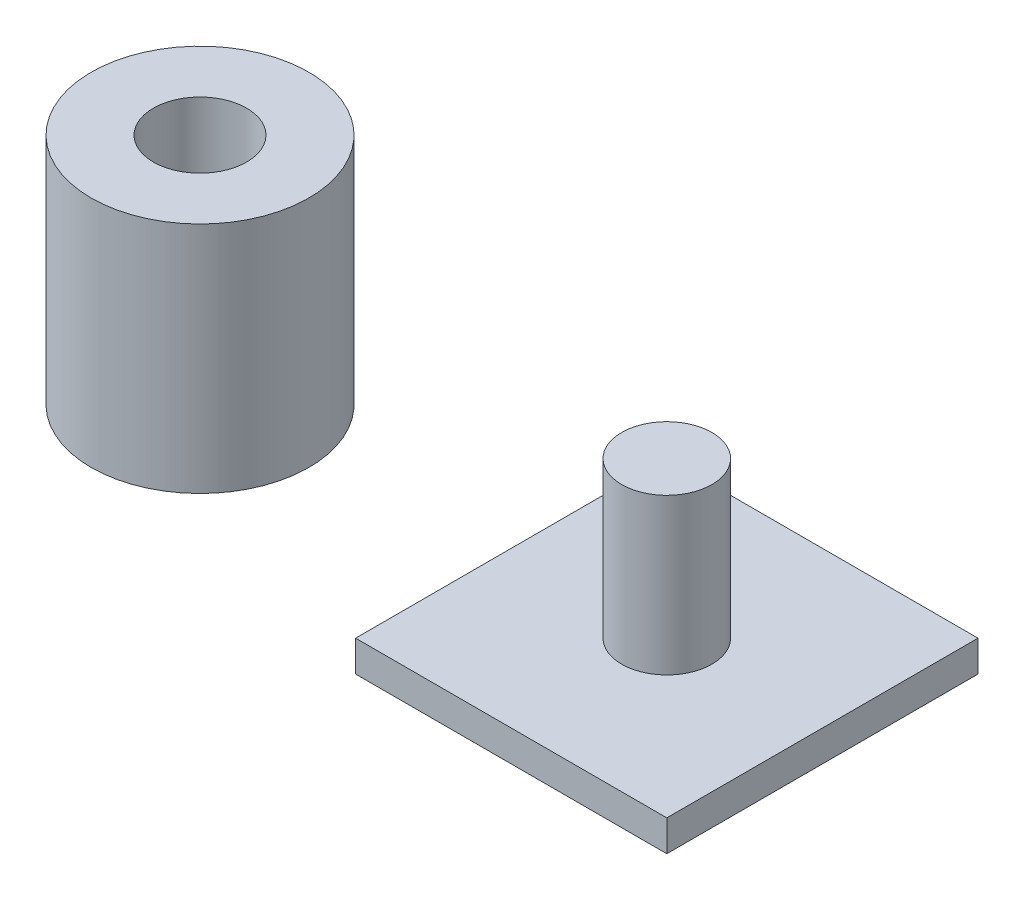
ISO-10303-21;
HEADER;
FILE_DESCRIPTION(('STEP AP214'),'2;1');
FILE_NAME('part.step','',(''),(''),'','','');
FILE_SCHEMA(('AUTOMOTIVE_DESIGN { 1 0 10303 214 1 1 1 1 }'));
ENDSEC;
DATA;
#1=APPLICATION_CONTEXT('core data for automotive mechanical design processes');
#2=APPLICATION_PROTOCOL_DEFINITION('international standard','automotive_design',2000,#1);
#3=PRODUCT_CONTEXT('',#1,'mechanical');
#4=PRODUCT('Part','Part','',(#3));
#5=PRODUCT_RELATED_PRODUCT_CATEGORY('part','',(#4));
#6=PRODUCT_DEFINITION_FORMATION('','',#4);
#7=PRODUCT_DEFINITION_CONTEXT('part definition',#1,'design');
#8=PRODUCT_DEFINITION('design','',#6,#7);
#9=PRODUCT_DEFINITION_SHAPE('','',#8);
#10=(LENGTH_UNIT() NAMED_UNIT(*) SI_UNIT(.MILLI.,.METRE.));
#11=(NAMED_UNIT(*) PLANE_ANGLE_UNIT() SI_UNIT($,.RADIAN.));
#12=(NAMED_UNIT(*) SI_UNIT($,.STERADIAN.) SOLID_ANGLE_UNIT());
#13=UNCERTAINTY_MEASURE_WITH_UNIT(LENGTH_MEASURE(1.E-05),#10,'distance_accuracy_value','');
#14=(GEOMETRIC_REPRESENTATION_CONTEXT(3) GLOBAL_UNCERTAINTY_ASSIGNED_CONTEXT((#13)) GLOBAL_UNIT_ASSIGNED_CONTEXT((#10,
#11,#12)) REPRESENTATION_CONTEXT('',''));
#15=CARTESIAN_POINT('',(0.,0.,0.));
#16=DIRECTION('',(0.,0.,1.));
#17=DIRECTION('',(1.,0.,0.));
#18=AXIS2_PLACEMENT_3D('',#15,#16,#17);
#19=CARTESIAN_POINT('',(-30.,15.,0.));
#20=DIRECTION('',(0.,1.,0.));
#21=DIRECTION('',(0.,0.,1.));
#22=AXIS2_PLACEMENT_3D('',#19,#20,#21);
#23=PLANE('',#22);
#24=CARTESIAN_POINT('',(-30.,15.,0.));
#25=DIRECTION('',(0.,1.,0.));
#26=DIRECTION('',(0.,0.,1.));
#27=AXIS2_PLACEMENT_3D('',#24,#25,#26);
#28=CIRCLE('',#27,7.);
#29=CARTESIAN_POINT('',(-30.,15.,7.));
#30=VERTEX_POINT('',#29);
#31=EDGE_CURVE('E11',#30,#30,#28,.T.);
#32=ORIENTED_EDGE('',*,*,#31,.T.);
#33=EDGE_LOOP('',(#32));
#34=FACE_BOUND('',#33,.T.);
#35=CARTESIAN_POINT('',(-30.,15.,0.));
#36=DIRECTION('',(0.,1.,0.));
#37=DIRECTION('',(0.,0.,1.));
#38=AXIS2_PLACEMENT_3D('',#35,#36,#37);
#39=CIRCLE('',#38,3.);
#40=CARTESIAN_POINT('',(-30.,15.,3.));
#41=VERTEX_POINT('',#40);
#42=EDGE_CURVE('E66',#41,#41,#39,.T.);
#43=ORIENTED_EDGE('',*,*,#42,.F.);
#44=EDGE_LOOP('',(#43));
#45=FACE_BOUND('',#44,.T.);
#46=ADVANCED_FACE('F53',(#34,#45),#23,.T.);
#47=CARTESIAN_POINT('',(-30.,0.,0.));
#48=DIRECTION('',(0.,1.,0.));
#49=DIRECTION('',(0.,0.,1.));
#50=AXIS2_PLACEMENT_3D('',#47,#48,#49);
#51=PLANE('',#50);
#52=CARTESIAN_POINT('',(-30.,0.,0.));
#53=DIRECTION('',(0.,1.,0.));
#54=DIRECTION('',(0.,0.,1.));
#55=AXIS2_PLACEMENT_3D('',#52,#53,#54);
#56=CIRCLE('',#55,7.);
#57=CARTESIAN_POINT('',(-30.,0.,7.));
#58=VERTEX_POINT('',#57);
#59=EDGE_CURVE('E57',#58,#58,#56,.T.);
#60=ORIENTED_EDGE('',*,*,#59,.F.);
#61=EDGE_LOOP('',(#60));
#62=FACE_BOUND('',#61,.T.);
#63=CARTESIAN_POINT('',(-30.,0.,0.));
#64=DIRECTION('',(0.,1.,0.));
#65=DIRECTION('',(0.,0.,1.));
#66=AXIS2_PLACEMENT_3D('',#63,#64,#65);
#67=CIRCLE('',#66,3.);
#68=CARTESIAN_POINT('',(-30.,0.,3.));
#69=VERTEX_POINT('',#68);
#70=EDGE_CURVE('E68',#69,#69,#67,.T.);
#71=ORIENTED_EDGE('',*,*,#70,.T.);
#72=EDGE_LOOP('',(#71));
#73=FACE_BOUND('',#72,.T.);
#74=ADVANCED_FACE('F80',(#62,#73),#51,.F.);
#75=CARTESIAN_POINT('',(-30.,15.,0.));
#76=DIRECTION('',(0.,-1.,0.));
#77=DIRECTION('',(0.,0.,-1.));
#78=AXIS2_PLACEMENT_3D('',#75,#76,#77);
#79=CYLINDRICAL_SURFACE('',#78,7.);
#80=ORIENTED_EDGE('',*,*,#31,.F.);
#81=EDGE_LOOP('',(#80));
#82=FACE_BOUND('',#81,.T.);
#83=ORIENTED_EDGE('',*,*,#59,.T.);
#84=EDGE_LOOP('',(#83));
#85=FACE_BOUND('',#84,.T.);
#86=ADVANCED_FACE('F55',(#82,#85),#79,.T.);
#87=CARTESIAN_POINT('',(-30.,15.,0.));
#88=DIRECTION('',(0.,-1.,0.));
#89=DIRECTION('',(0.,0.,-1.));
#90=AXIS2_PLACEMENT_3D('',#87,#88,#89);
#91=CYLINDRICAL_SURFACE('',#90,3.);
#92=ORIENTED_EDGE('',*,*,#42,.T.);
#93=EDGE_LOOP('',(#92));
#94=FACE_BOUND('',#93,.T.);
#95=ORIENTED_EDGE('',*,*,#70,.F.);
#96=EDGE_LOOP('',(#95));
#97=FACE_BOUND('',#96,.T.);
#98=ADVANCED_FACE('F76',(#94,#97),#91,.F.);
#99=CLOSED_SHELL('',(#46,#74,#86,#98));
#100=MANIFOLD_SOLID_BREP('B2',#99);
#101=CARTESIAN_POINT('',(0.,12.,0.));
#102=DIRECTION('',(0.,-1.,0.));
#103=DIRECTION('',(0.,0.,-1.));
#104=AXIS2_PLACEMENT_3D('',#101,#102,#103);
#105=CYLINDRICAL_SURFACE('',#104,2.9);
#106=CARTESIAN_POINT('',(0.,2.,0.));
#107=DIRECTION('',(0.,1.,0.));
#108=DIRECTION('',(0.,0.,1.));
#109=AXIS2_PLACEMENT_3D('',#106,#107,#108);
#110=CIRCLE('',#109,2.9);
#111=CARTESIAN_POINT('',(0.,2.,2.9));
#112=VERTEX_POINT('',#111);
#113=EDGE_CURVE('E197',#112,#112,#110,.T.);
#114=ORIENTED_EDGE('',*,*,#113,.T.);
#115=EDGE_LOOP('',(#114));
#116=FACE_BOUND('',#115,.T.);
#117=CARTESIAN_POINT('',(0.,12.,0.));
#118=DIRECTION('',(0.,1.,0.));
#119=DIRECTION('',(0.,0.,1.));
#120=AXIS2_PLACEMENT_3D('',#117,#118,#119);
#121=CIRCLE('',#120,2.9);
#122=CARTESIAN_POINT('',(0.,12.,2.9));
#123=VERTEX_POINT('',#122);
#124=EDGE_CURVE('E51',#123,#123,#121,.T.);
#125=ORIENTED_EDGE('',*,*,#124,.F.);
#126=EDGE_LOOP('',(#125));
#127=FACE_BOUND('',#126,.T.);
#128=ADVANCED_FACE('F127',(#116,#127),#105,.T.);
#129=CARTESIAN_POINT('',(0.,12.,0.));
#130=DIRECTION('',(0.,1.,0.));
#131=DIRECTION('',(0.,0.,1.));
#132=AXIS2_PLACEMENT_3D('',#129,#130,#131);
#133=PLANE('',#132);
#134=ORIENTED_EDGE('',*,*,#124,.T.);
#135=EDGE_LOOP('',(#134));
#136=FACE_BOUND('',#135,.T.);
#137=ADVANCED_FACE('F215',(#136),#133,.T.);
#138=CARTESIAN_POINT('',(0.,2.,0.));
#139=DIRECTION('',(0.,1.,0.));
#140=DIRECTION('',(0.,0.,1.));
#141=AXIS2_PLACEMENT_3D('',#138,#139,#140);
#142=PLANE('',#141);
#143=DIRECTION('',(0.,0.,-1.));
#144=VECTOR('',#143,1.);
#145=CARTESIAN_POINT('',(10.,2.,-10.));
#146=LINE('',#145,#144);
#147=CARTESIAN_POINT('',(10.,2.,10.));
#148=VERTEX_POINT('',#147);
#149=CARTESIAN_POINT('',(10.,2.,-10.));
#150=VERTEX_POINT('',#149);
#151=EDGE_CURVE('E180',#148,#150,#146,.T.);
#152=ORIENTED_EDGE('',*,*,#151,.T.);
#153=DIRECTION('',(-1.,0.,0.));
#154=VECTOR('',#153,1.);
#155=CARTESIAN_POINT('',(-10.,2.,-10.));
#156=LINE('',#155,#154);
#157=CARTESIAN_POINT('',(-10.,2.,-10.));
#158=VERTEX_POINT('',#157);
#159=EDGE_CURVE('E174',#150,#158,#156,.T.);
#160=ORIENTED_EDGE('',*,*,#159,.T.);
#161=DIRECTION('',(0.,0.,1.));
#162=VECTOR('',#161,1.);
#163=CARTESIAN_POINT('',(-10.,2.,-10.));
#164=LINE('',#163,#162);
#165=CARTESIAN_POINT('',(-10.,2.,10.));
#166=VERTEX_POINT('',#165);
#167=EDGE_CURVE('E178',#158,#166,#164,.T.);
#168=ORIENTED_EDGE('',*,*,#167,.T.);
#169=DIRECTION('',(1.,0.,0.));
#170=VECTOR('',#169,1.);
#171=CARTESIAN_POINT('',(-10.,2.,10.));
#172=LINE('',#171,#170);
#173=EDGE_CURVE('E143',#166,#148,#172,.T.);
#174=ORIENTED_EDGE('',*,*,#173,.T.);
#175=EDGE_LOOP('',(#152,#160,#168,#174));
#176=FACE_BOUND('',#175,.T.);
#177=ORIENTED_EDGE('',*,*,#113,.F.);
#178=EDGE_LOOP('',(#177));
#179=FACE_BOUND('',#178,.T.);
#180=ADVANCED_FACE('F175',(#176,#179),#142,.T.);
#181=CARTESIAN_POINT('',(10.,2.,-10.));
#182=DIRECTION('',(-1.,0.,0.));
#183=DIRECTION('',(0.,0.,1.));
#184=AXIS2_PLACEMENT_3D('',#181,#182,#183);
#185=PLANE('',#184);
#186=DIRECTION('',(0.,0.,-1.));
#187=VECTOR('',#186,1.);
#188=CARTESIAN_POINT('',(10.,0.,-10.));
#189=LINE('',#188,#187);
#190=CARTESIAN_POINT('',(10.,0.,10.));
#191=VERTEX_POINT('',#190);
#192=CARTESIAN_POINT('',(10.,0.,-10.));
#193=VERTEX_POINT('',#192);
#194=EDGE_CURVE('E194',#191,#193,#189,.T.);
#195=ORIENTED_EDGE('',*,*,#194,.T.);
#196=DIRECTION('',(0.,-1.,0.));
#197=VECTOR('',#196,1.);
#198=CARTESIAN_POINT('',(10.,2.,-10.));
#199=LINE('',#198,#197);
#200=EDGE_CURVE('E135',#150,#193,#199,.T.);
#201=ORIENTED_EDGE('',*,*,#200,.F.);
#202=ORIENTED_EDGE('',*,*,#151,.F.);
#203=DIRECTION('',(0.,-1.,0.));
#204=VECTOR('',#203,1.);
#205=CARTESIAN_POINT('',(10.,2.,10.));
#206=LINE('',#205,#204);
#207=EDGE_CURVE('E190',#148,#191,#206,.T.);
#208=ORIENTED_EDGE('',*,*,#207,.T.);
#209=EDGE_LOOP('',(#195,#201,#202,#208));
#210=FACE_BOUND('',#209,.T.);
#211=ADVANCED_FACE('F204',(#210),#185,.F.);
#212=CARTESIAN_POINT('',(-10.,2.,-10.));
#213=DIRECTION('',(0.,0.,1.));
#214=DIRECTION('',(1.,0.,0.));
#215=AXIS2_PLACEMENT_3D('',#212,#213,#214);
#216=PLANE('',#215);
#217=DIRECTION('',(-1.,0.,0.));
#218=VECTOR('',#217,1.);
#219=CARTESIAN_POINT('',(-10.,0.,-10.));
#220=LINE('',#219,#218);
#221=CARTESIAN_POINT('',(-10.,0.,-10.));
#222=VERTEX_POINT('',#221);
#223=EDGE_CURVE('E185',#193,#222,#220,.T.);
#224=ORIENTED_EDGE('',*,*,#223,.T.);
#225=DIRECTION('',(0.,-1.,0.));
#226=VECTOR('',#225,1.);
#227=CARTESIAN_POINT('',(-10.,2.,-10.));
#228=LINE('',#227,#226);
#229=EDGE_CURVE('E183',#158,#222,#228,.T.);
#230=ORIENTED_EDGE('',*,*,#229,.F.);
#231=ORIENTED_EDGE('',*,*,#159,.F.);
#232=ORIENTED_EDGE('',*,*,#200,.T.);
#233=EDGE_LOOP('',(#224,#230,#231,#232));
#234=FACE_BOUND('',#233,.T.);
#235=ADVANCED_FACE('F184',(#234),#216,.F.);
#236=CARTESIAN_POINT('',(-10.,2.,-10.));
#237=DIRECTION('',(1.,0.,0.));
#238=DIRECTION('',(0.,0.,-1.));
#239=AXIS2_PLACEMENT_3D('',#236,#237,#238);
#240=PLANE('',#239);
#241=DIRECTION('',(0.,0.,1.));
#242=VECTOR('',#241,1.);
#243=CARTESIAN_POINT('',(-10.,0.,-10.));
#244=LINE('',#243,#242);
#245=CARTESIAN_POINT('',(-10.,0.,10.));
#246=VERTEX_POINT('',#245);
#247=EDGE_CURVE('E160',#222,#246,#244,.T.);
#248=ORIENTED_EDGE('',*,*,#247,.T.);
#249=DIRECTION('',(0.,-1.,0.));
#250=VECTOR('',#249,1.);
#251=CARTESIAN_POINT('',(-10.,2.,10.));
#252=LINE('',#251,#250);
#253=EDGE_CURVE('E186',#166,#246,#252,.T.);
#254=ORIENTED_EDGE('',*,*,#253,.F.);
#255=ORIENTED_EDGE('',*,*,#167,.F.);
#256=ORIENTED_EDGE('',*,*,#229,.T.);
#257=EDGE_LOOP('',(#248,#254,#255,#256));
#258=FACE_BOUND('',#257,.T.);
#259=ADVANCED_FACE('F188',(#258),#240,.F.);
#260=CARTESIAN_POINT('',(-10.,2.,10.));
#261=DIRECTION('',(0.,0.,-1.));
#262=DIRECTION('',(-1.,0.,0.));
#263=AXIS2_PLACEMENT_3D('',#260,#261,#262);
#264=PLANE('',#263);
#265=DIRECTION('',(1.,0.,0.));
#266=VECTOR('',#265,1.);
#267=CARTESIAN_POINT('',(-10.,0.,10.));
#268=LINE('',#267,#266);
#269=EDGE_CURVE('E166',#246,#191,#268,.T.);
#270=ORIENTED_EDGE('',*,*,#269,.T.);
#271=ORIENTED_EDGE('',*,*,#207,.F.);
#272=ORIENTED_EDGE('',*,*,#173,.F.);
#273=ORIENTED_EDGE('',*,*,#253,.T.);
#274=EDGE_LOOP('',(#270,#271,#272,#273));
#275=FACE_BOUND('',#274,.T.);
#276=ADVANCED_FACE('F208',(#275),#264,.F.);
#277=CARTESIAN_POINT('',(0.,0.,0.));
#278=DIRECTION('',(0.,1.,0.));
#279=DIRECTION('',(0.,0.,1.));
#280=AXIS2_PLACEMENT_3D('',#277,#278,#279);
#281=PLANE('',#280);
#282=ORIENTED_EDGE('',*,*,#194,.F.);
#283=ORIENTED_EDGE('',*,*,#269,.F.);
#284=ORIENTED_EDGE('',*,*,#247,.F.);
#285=ORIENTED_EDGE('',*,*,#223,.F.);
#286=EDGE_LOOP('',(#282,#283,#284,#285));
#287=FACE_BOUND('',#286,.T.);
#288=ADVANCED_FACE('F206',(#287),#281,.F.);
#289=CLOSED_SHELL('',(#128,#137,#180,#211,#235,#259,#276,#288));
#290=MANIFOLD_SOLID_BREP('B6',#289);
#291=ADVANCED_BREP_SHAPE_REPRESENTATION('',(#18,#100,#290),#14);
#292=SHAPE_DEFINITION_REPRESENTATION(#9,#291);
ENDSEC;
END-ISO-10303-21;
